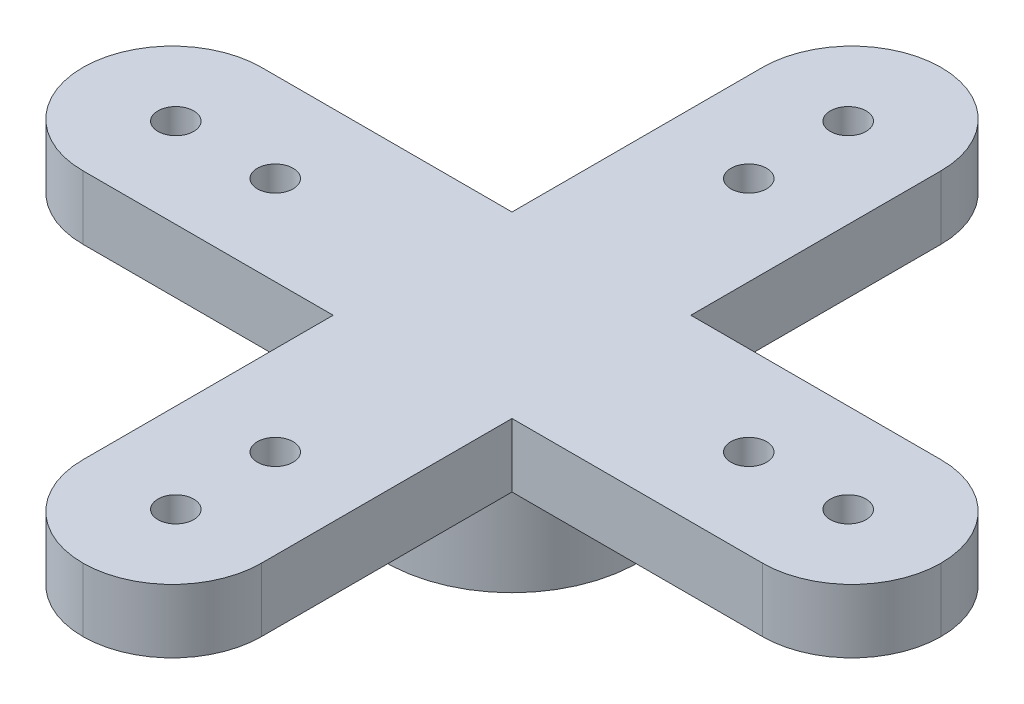
ISO-10303-21;
HEADER;
FILE_DESCRIPTION(('STEP AP214'),'2;1');
FILE_NAME('part.step','',(''),(''),'','','');
FILE_SCHEMA(('AUTOMOTIVE_DESIGN { 1 0 10303 214 1 1 1 1 }'));
ENDSEC;
DATA;
#1=APPLICATION_CONTEXT('core data for automotive mechanical design processes');
#2=APPLICATION_PROTOCOL_DEFINITION('international standard','automotive_design',2000,#1);
#3=PRODUCT_CONTEXT('',#1,'mechanical');
#4=PRODUCT('Part','Part','',(#3));
#5=PRODUCT_RELATED_PRODUCT_CATEGORY('part','',(#4));
#6=PRODUCT_DEFINITION_FORMATION('','',#4);
#7=PRODUCT_DEFINITION_CONTEXT('part definition',#1,'design');
#8=PRODUCT_DEFINITION('design','',#6,#7);
#9=PRODUCT_DEFINITION_SHAPE('','',#8);
#10=(LENGTH_UNIT() NAMED_UNIT(*) SI_UNIT(.MILLI.,.METRE.));
#11=(NAMED_UNIT(*) PLANE_ANGLE_UNIT() SI_UNIT($,.RADIAN.));
#12=(NAMED_UNIT(*) SI_UNIT($,.STERADIAN.) SOLID_ANGLE_UNIT());
#13=UNCERTAINTY_MEASURE_WITH_UNIT(LENGTH_MEASURE(1.E-05),#10,'distance_accuracy_value','');
#14=(GEOMETRIC_REPRESENTATION_CONTEXT(3) GLOBAL_UNCERTAINTY_ASSIGNED_CONTEXT((#13)) GLOBAL_UNIT_ASSIGNED_CONTEXT((#10,
#11,#12)) REPRESENTATION_CONTEXT('',''));
#15=CARTESIAN_POINT('',(0.,0.,0.));
#16=DIRECTION('',(0.,0.,1.));
#17=DIRECTION('',(1.,0.,0.));
#18=AXIS2_PLACEMENT_3D('',#15,#16,#17);
#19=CARTESIAN_POINT('',(0.,0.,0.));
#20=DIRECTION('',(0.,-1.,0.));
#21=DIRECTION('',(0.,0.,-1.));
#22=AXIS2_PLACEMENT_3D('',#19,#20,#21);
#23=PLANE('',#22);
#24=CARTESIAN_POINT('',(12.,0.,2.5));
#25=DIRECTION('',(0.,-1.,0.));
#26=DIRECTION('',(0.,0.,-1.));
#27=AXIS2_PLACEMENT_3D('',#24,#25,#26);
#28=CIRCLE('',#27,3.53553390593274);
#29=CARTESIAN_POINT('',(14.5,0.,0.));
#30=VERTEX_POINT('',#29);
#31=CARTESIAN_POINT('',(14.5,0.,5.));
#32=VERTEX_POINT('',#31);
#33=EDGE_CURVE('E45',#30,#32,#28,.T.);
#34=ORIENTED_EDGE('',*,*,#33,.F.);
#35=DIRECTION('',(-1.,0.,0.));
#36=VECTOR('',#35,1.);
#37=CARTESIAN_POINT('',(14.5,0.,0.));
#38=LINE('',#37,#36);
#39=CARTESIAN_POINT('',(21.5,0.,0.));
#40=VERTEX_POINT('',#39);
#41=EDGE_CURVE('E164',#40,#30,#38,.T.);
#42=ORIENTED_EDGE('',*,*,#41,.F.);
#43=CARTESIAN_POINT('',(21.5,0.,2.5));
#44=DIRECTION('',(0.,-1.,0.));
#45=DIRECTION('',(0.,0.,-1.));
#46=AXIS2_PLACEMENT_3D('',#43,#44,#45);
#47=CIRCLE('',#46,2.5);
#48=CARTESIAN_POINT('',(24.,0.,2.5));
#49=VERTEX_POINT('',#48);
#50=EDGE_CURVE('E297',#40,#49,#47,.T.);
#51=ORIENTED_EDGE('',*,*,#50,.T.);
#52=CARTESIAN_POINT('',(21.5,0.,2.5));
#53=DIRECTION('',(0.,-1.,0.));
#54=DIRECTION('',(0.,0.,-1.));
#55=AXIS2_PLACEMENT_3D('',#52,#53,#54);
#56=CIRCLE('',#55,2.5);
#57=CARTESIAN_POINT('',(21.5,0.,5.));
#58=VERTEX_POINT('',#57);
#59=EDGE_CURVE('E295',#49,#58,#56,.T.);
#60=ORIENTED_EDGE('',*,*,#59,.T.);
#61=DIRECTION('',(1.,0.,0.));
#62=VECTOR('',#61,1.);
#63=CARTESIAN_POINT('',(24.,0.,5.));
#64=LINE('',#63,#62);
#65=EDGE_CURVE('E185',#32,#58,#64,.T.);
#66=ORIENTED_EDGE('',*,*,#65,.F.);
#67=EDGE_LOOP('',(#34,#42,#51,#60,#66));
#68=FACE_BOUND('',#67,.T.);
#69=CARTESIAN_POINT('',(21.4,0.,2.50000000000006));
#70=DIRECTION('',(0.,1.,0.));
#71=DIRECTION('',(0.,0.,1.));
#72=AXIS2_PLACEMENT_3D('',#69,#70,#71);
#73=CIRCLE('',#72,0.500000000000001);
#74=CARTESIAN_POINT('',(21.4,0.,3.00000000000007));
#75=VERTEX_POINT('',#74);
#76=EDGE_CURVE('E235',#75,#75,#73,.T.);
#77=ORIENTED_EDGE('',*,*,#76,.T.);
#78=EDGE_LOOP('',(#77));
#79=FACE_BOUND('',#78,.T.);
#80=CARTESIAN_POINT('',(18.62,0.,2.50000000000004));
#81=DIRECTION('',(0.,1.,0.));
#82=DIRECTION('',(0.,0.,1.));
#83=AXIS2_PLACEMENT_3D('',#80,#81,#82);
#84=CIRCLE('',#83,0.500000000000001);
#85=CARTESIAN_POINT('',(18.62,0.,3.00000000000005));
#86=VERTEX_POINT('',#85);
#87=EDGE_CURVE('E216',#86,#86,#84,.T.);
#88=ORIENTED_EDGE('',*,*,#87,.T.);
#89=EDGE_LOOP('',(#88));
#90=FACE_BOUND('',#89,.T.);
#91=ADVANCED_FACE('F34',(#68,#79,#90),#23,.T.);
#92=CARTESIAN_POINT('',(9.5,0.,5.));
#93=VERTEX_POINT('',#92);
#94=EDGE_CURVE('E11',#32,#93,#28,.T.);
#95=ORIENTED_EDGE('',*,*,#94,.F.);
#96=DIRECTION('',(0.,0.,-1.));
#97=VECTOR('',#96,1.);
#98=CARTESIAN_POINT('',(14.5,0.,14.5));
#99=LINE('',#98,#97);
#100=CARTESIAN_POINT('',(14.5,0.,12.));
#101=VERTEX_POINT('',#100);
#102=EDGE_CURVE('E275',#101,#32,#99,.T.);
#103=ORIENTED_EDGE('',*,*,#102,.F.);
#104=CARTESIAN_POINT('',(12.,0.,12.));
#105=DIRECTION('',(0.,-1.,0.));
#106=DIRECTION('',(0.,0.,-1.));
#107=AXIS2_PLACEMENT_3D('',#104,#105,#106);
#108=CIRCLE('',#107,2.5);
#109=CARTESIAN_POINT('',(12.,0.,14.5));
#110=VERTEX_POINT('',#109);
#111=EDGE_CURVE('E291',#101,#110,#108,.T.);
#112=ORIENTED_EDGE('',*,*,#111,.T.);
#113=CARTESIAN_POINT('',(12.,0.,12.));
#114=DIRECTION('',(0.,-1.,0.));
#115=DIRECTION('',(0.,0.,-1.));
#116=AXIS2_PLACEMENT_3D('',#113,#114,#115);
#117=CIRCLE('',#116,2.5);
#118=CARTESIAN_POINT('',(9.5,0.,12.));
#119=VERTEX_POINT('',#118);
#120=EDGE_CURVE('E293',#110,#119,#117,.T.);
#121=ORIENTED_EDGE('',*,*,#120,.T.);
#122=DIRECTION('',(0.,0.,1.));
#123=VECTOR('',#122,1.);
#124=CARTESIAN_POINT('',(9.5,0.,5.));
#125=LINE('',#124,#123);
#126=EDGE_CURVE('E271',#93,#119,#125,.T.);
#127=ORIENTED_EDGE('',*,*,#126,.F.);
#128=EDGE_LOOP('',(#95,#103,#112,#121,#127));
#129=FACE_BOUND('',#128,.T.);
#130=CARTESIAN_POINT('',(11.9999999999999,0.,11.9));
#131=DIRECTION('',(0.,1.,0.));
#132=DIRECTION('',(0.,0.,1.));
#133=AXIS2_PLACEMENT_3D('',#130,#131,#132);
#134=CIRCLE('',#133,0.499999999999999);
#135=CARTESIAN_POINT('',(11.9999999999999,0.,12.4));
#136=VERTEX_POINT('',#135);
#137=EDGE_CURVE('E223',#136,#136,#134,.T.);
#138=ORIENTED_EDGE('',*,*,#137,.T.);
#139=EDGE_LOOP('',(#138));
#140=FACE_BOUND('',#139,.T.);
#141=CARTESIAN_POINT('',(11.9999999999999,0.,9.12));
#142=DIRECTION('',(0.,1.,0.));
#143=DIRECTION('',(0.,0.,1.));
#144=AXIS2_PLACEMENT_3D('',#141,#142,#143);
#145=CIRCLE('',#144,0.500000000000001);
#146=CARTESIAN_POINT('',(11.9999999999999,0.,9.62));
#147=VERTEX_POINT('',#146);
#148=EDGE_CURVE('E209',#147,#147,#145,.T.);
#149=ORIENTED_EDGE('',*,*,#148,.T.);
#150=EDGE_LOOP('',(#149));
#151=FACE_BOUND('',#150,.T.);
#152=ADVANCED_FACE('F395',(#129,#140,#151),#23,.T.);
#153=CARTESIAN_POINT('',(9.5,0.,0.));
#154=VERTEX_POINT('',#153);
#155=EDGE_CURVE('E43',#93,#154,#28,.T.);
#156=ORIENTED_EDGE('',*,*,#155,.F.);
#157=DIRECTION('',(1.,0.,0.));
#158=VECTOR('',#157,1.);
#159=CARTESIAN_POINT('',(9.5,0.,5.));
#160=LINE('',#159,#158);
#161=CARTESIAN_POINT('',(2.5,0.,5.));
#162=VERTEX_POINT('',#161);
#163=EDGE_CURVE('E268',#162,#93,#160,.T.);
#164=ORIENTED_EDGE('',*,*,#163,.F.);
#165=CARTESIAN_POINT('',(2.5,0.,2.5));
#166=DIRECTION('',(0.,-1.,0.));
#167=DIRECTION('',(0.,0.,-1.));
#168=AXIS2_PLACEMENT_3D('',#165,#166,#167);
#169=CIRCLE('',#168,2.5);
#170=CARTESIAN_POINT('',(0.,0.,2.5));
#171=VERTEX_POINT('',#170);
#172=EDGE_CURVE('E304',#162,#171,#169,.T.);
#173=ORIENTED_EDGE('',*,*,#172,.T.);
#174=CARTESIAN_POINT('',(2.5,0.,2.5));
#175=DIRECTION('',(0.,-1.,0.));
#176=DIRECTION('',(0.,0.,-1.));
#177=AXIS2_PLACEMENT_3D('',#174,#175,#176);
#178=CIRCLE('',#177,2.5);
#179=CARTESIAN_POINT('',(2.5,0.,0.));
#180=VERTEX_POINT('',#179);
#181=EDGE_CURVE('E302',#171,#180,#178,.T.);
#182=ORIENTED_EDGE('',*,*,#181,.T.);
#183=DIRECTION('',(-1.,0.,0.));
#184=VECTOR('',#183,1.);
#185=CARTESIAN_POINT('',(0.,0.,0.));
#186=LINE('',#185,#184);
#187=EDGE_CURVE('E253',#154,#180,#186,.T.);
#188=ORIENTED_EDGE('',*,*,#187,.F.);
#189=EDGE_LOOP('',(#156,#164,#173,#182,#188));
#190=FACE_BOUND('',#189,.T.);
#191=CARTESIAN_POINT('',(5.38,0.,2.5));
#192=DIRECTION('',(0.,1.,0.));
#193=DIRECTION('',(0.,0.,1.));
#194=AXIS2_PLACEMENT_3D('',#191,#192,#193);
#195=CIRCLE('',#194,0.5);
#196=CARTESIAN_POINT('',(5.38,0.,3.));
#197=VERTEX_POINT('',#196);
#198=EDGE_CURVE('E208',#197,#197,#195,.T.);
#199=ORIENTED_EDGE('',*,*,#198,.T.);
#200=EDGE_LOOP('',(#199));
#201=FACE_BOUND('',#200,.T.);
#202=CARTESIAN_POINT('',(2.6,0.,2.5));
#203=DIRECTION('',(0.,1.,0.));
#204=DIRECTION('',(0.,0.,1.));
#205=AXIS2_PLACEMENT_3D('',#202,#203,#204);
#206=CIRCLE('',#205,0.5);
#207=CARTESIAN_POINT('',(2.6,0.,3.));
#208=VERTEX_POINT('',#207);
#209=EDGE_CURVE('E202',#208,#208,#206,.T.);
#210=ORIENTED_EDGE('',*,*,#209,.T.);
#211=EDGE_LOOP('',(#210));
#212=FACE_BOUND('',#211,.T.);
#213=ADVANCED_FACE('F398',(#190,#201,#212),#23,.T.);
#214=CARTESIAN_POINT('',(9.5,1.78,5.));
#215=DIRECTION('',(0.,0.,-1.));
#216=DIRECTION('',(-1.,0.,0.));
#217=AXIS2_PLACEMENT_3D('',#214,#215,#216);
#218=PLANE('',#217);
#219=DIRECTION('',(1.,0.,0.));
#220=VECTOR('',#219,1.);
#221=CARTESIAN_POINT('',(9.5,1.78,5.));
#222=LINE('',#221,#220);
#223=CARTESIAN_POINT('',(2.5,1.78,5.));
#224=VERTEX_POINT('',#223);
#225=CARTESIAN_POINT('',(9.5,1.78,5.));
#226=VERTEX_POINT('',#225);
#227=EDGE_CURVE('E250',#224,#226,#222,.T.);
#228=ORIENTED_EDGE('',*,*,#227,.F.);
#229=DIRECTION('',(0.,-1.,0.));
#230=VECTOR('',#229,1.);
#231=CARTESIAN_POINT('',(2.5,1.78,5.));
#232=LINE('',#231,#230);
#233=EDGE_CURVE('E288',#224,#162,#232,.T.);
#234=ORIENTED_EDGE('',*,*,#233,.T.);
#235=ORIENTED_EDGE('',*,*,#163,.T.);
#236=DIRECTION('',(0.,-1.,0.));
#237=VECTOR('',#236,1.);
#238=CARTESIAN_POINT('',(9.5,1.78,5.));
#239=LINE('',#238,#237);
#240=EDGE_CURVE('E285',#226,#93,#239,.T.);
#241=ORIENTED_EDGE('',*,*,#240,.F.);
#242=EDGE_LOOP('',(#228,#234,#235,#241));
#243=FACE_BOUND('',#242,.T.);
#244=ADVANCED_FACE('F388',(#243),#218,.F.);
#245=CARTESIAN_POINT('',(9.5,1.78,5.));
#246=DIRECTION('',(1.,0.,0.));
#247=DIRECTION('',(0.,0.,-1.));
#248=AXIS2_PLACEMENT_3D('',#245,#246,#247);
#249=PLANE('',#248);
#250=ORIENTED_EDGE('',*,*,#126,.T.);
#251=DIRECTION('',(0.,-1.,0.));
#252=VECTOR('',#251,1.);
#253=CARTESIAN_POINT('',(9.5,1.78,12.));
#254=LINE('',#253,#252);
#255=CARTESIAN_POINT('',(9.5,1.78,12.));
#256=VERTEX_POINT('',#255);
#257=EDGE_CURVE('E197',#119,#256,#254,.F.);
#258=ORIENTED_EDGE('',*,*,#257,.T.);
#259=DIRECTION('',(0.,0.,1.));
#260=VECTOR('',#259,1.);
#261=CARTESIAN_POINT('',(9.5,1.78,5.));
#262=LINE('',#261,#260);
#263=EDGE_CURVE('E252',#226,#256,#262,.T.);
#264=ORIENTED_EDGE('',*,*,#263,.F.);
#265=ORIENTED_EDGE('',*,*,#240,.T.);
#266=EDGE_LOOP('',(#250,#258,#264,#265));
#267=FACE_BOUND('',#266,.T.);
#268=ADVANCED_FACE('F393',(#267),#249,.F.);
#269=CARTESIAN_POINT('',(14.5,1.78,14.5));
#270=DIRECTION('',(-1.,0.,0.));
#271=DIRECTION('',(0.,0.,1.));
#272=AXIS2_PLACEMENT_3D('',#269,#270,#271);
#273=PLANE('',#272);
#274=DIRECTION('',(0.,0.,-1.));
#275=VECTOR('',#274,1.);
#276=CARTESIAN_POINT('',(14.5,1.78,14.5));
#277=LINE('',#276,#275);
#278=CARTESIAN_POINT('',(14.5,1.78,12.));
#279=VERTEX_POINT('',#278);
#280=CARTESIAN_POINT('',(14.5,1.78,5.));
#281=VERTEX_POINT('',#280);
#282=EDGE_CURVE('E256',#279,#281,#277,.T.);
#283=ORIENTED_EDGE('',*,*,#282,.F.);
#284=DIRECTION('',(0.,-1.,0.));
#285=VECTOR('',#284,1.);
#286=CARTESIAN_POINT('',(14.5,1.78,12.));
#287=LINE('',#286,#285);
#288=EDGE_CURVE('E196',#279,#101,#287,.T.);
#289=ORIENTED_EDGE('',*,*,#288,.T.);
#290=ORIENTED_EDGE('',*,*,#102,.T.);
#291=DIRECTION('',(0.,-1.,0.));
#292=VECTOR('',#291,1.);
#293=CARTESIAN_POINT('',(14.5,1.78,5.));
#294=LINE('',#293,#292);
#295=EDGE_CURVE('E175',#281,#32,#294,.T.);
#296=ORIENTED_EDGE('',*,*,#295,.F.);
#297=EDGE_LOOP('',(#283,#289,#290,#296));
#298=FACE_BOUND('',#297,.T.);
#299=ADVANCED_FACE('F355',(#298),#273,.F.);
#300=CARTESIAN_POINT('',(24.,1.78,5.));
#301=DIRECTION('',(0.,0.,-1.));
#302=DIRECTION('',(-1.,0.,0.));
#303=AXIS2_PLACEMENT_3D('',#300,#301,#302);
#304=PLANE('',#303);
#305=ORIENTED_EDGE('',*,*,#65,.T.);
#306=DIRECTION('',(0.,-1.,0.));
#307=VECTOR('',#306,1.);
#308=CARTESIAN_POINT('',(21.5,1.78,5.));
#309=LINE('',#308,#307);
#310=CARTESIAN_POINT('',(21.5,1.78,5.));
#311=VERTEX_POINT('',#310);
#312=EDGE_CURVE('E328',#58,#311,#309,.F.);
#313=ORIENTED_EDGE('',*,*,#312,.T.);
#314=DIRECTION('',(1.,0.,0.));
#315=VECTOR('',#314,1.);
#316=CARTESIAN_POINT('',(24.,1.78,5.));
#317=LINE('',#316,#315);
#318=EDGE_CURVE('E258',#281,#311,#317,.T.);
#319=ORIENTED_EDGE('',*,*,#318,.F.);
#320=ORIENTED_EDGE('',*,*,#295,.T.);
#321=EDGE_LOOP('',(#305,#313,#319,#320));
#322=FACE_BOUND('',#321,.T.);
#323=ADVANCED_FACE('F359',(#322),#304,.F.);
#324=CARTESIAN_POINT('',(14.5,1.78,0.));
#325=DIRECTION('',(0.,0.,1.));
#326=DIRECTION('',(1.,0.,0.));
#327=AXIS2_PLACEMENT_3D('',#324,#325,#326);
#328=PLANE('',#327);
#329=DIRECTION('',(-1.,0.,0.));
#330=VECTOR('',#329,1.);
#331=CARTESIAN_POINT('',(14.5,1.78,0.));
#332=LINE('',#331,#330);
#333=CARTESIAN_POINT('',(21.5,1.78,0.));
#334=VERTEX_POINT('',#333);
#335=CARTESIAN_POINT('',(14.5,1.78,0.));
#336=VERTEX_POINT('',#335);
#337=EDGE_CURVE('E261',#334,#336,#332,.T.);
#338=ORIENTED_EDGE('',*,*,#337,.F.);
#339=DIRECTION('',(0.,-1.,0.));
#340=VECTOR('',#339,1.);
#341=CARTESIAN_POINT('',(21.5,1.78,0.));
#342=LINE('',#341,#340);
#343=EDGE_CURVE('E183',#334,#40,#342,.T.);
#344=ORIENTED_EDGE('',*,*,#343,.T.);
#345=ORIENTED_EDGE('',*,*,#41,.T.);
#346=DIRECTION('',(0.,-1.,0.));
#347=VECTOR('',#346,1.);
#348=CARTESIAN_POINT('',(14.5,1.78,0.));
#349=LINE('',#348,#347);
#350=EDGE_CURVE('E168',#336,#30,#349,.T.);
#351=ORIENTED_EDGE('',*,*,#350,.F.);
#352=EDGE_LOOP('',(#338,#344,#345,#351));
#353=FACE_BOUND('',#352,.T.);
#354=ADVANCED_FACE('F181',(#353),#328,.F.);
#355=CARTESIAN_POINT('',(14.5,1.78,0.));
#356=DIRECTION('',(-1.,0.,0.));
#357=DIRECTION('',(0.,0.,1.));
#358=AXIS2_PLACEMENT_3D('',#355,#356,#357);
#359=PLANE('',#358);
#360=DIRECTION('',(0.,0.,-1.));
#361=VECTOR('',#360,1.);
#362=CARTESIAN_POINT('',(14.5,0.,0.));
#363=LINE('',#362,#361);
#364=CARTESIAN_POINT('',(14.5,0.,-7.));
#365=VERTEX_POINT('',#364);
#366=EDGE_CURVE('E151',#30,#365,#363,.T.);
#367=ORIENTED_EDGE('',*,*,#366,.T.);
#368=DIRECTION('',(0.,-1.,0.));
#369=VECTOR('',#368,1.);
#370=CARTESIAN_POINT('',(14.5,1.78,-7.));
#371=LINE('',#370,#369);
#372=CARTESIAN_POINT('',(14.5,1.78,-7.));
#373=VERTEX_POINT('',#372);
#374=EDGE_CURVE('E325',#365,#373,#371,.F.);
#375=ORIENTED_EDGE('',*,*,#374,.T.);
#376=DIRECTION('',(0.,0.,-1.));
#377=VECTOR('',#376,1.);
#378=CARTESIAN_POINT('',(14.5,1.78,0.));
#379=LINE('',#378,#377);
#380=EDGE_CURVE('E172',#336,#373,#379,.T.);
#381=ORIENTED_EDGE('',*,*,#380,.F.);
#382=ORIENTED_EDGE('',*,*,#350,.T.);
#383=EDGE_LOOP('',(#367,#375,#381,#382));
#384=FACE_BOUND('',#383,.T.);
#385=ADVANCED_FACE('F170',(#384),#359,.F.);
#386=CARTESIAN_POINT('',(9.5,1.78,-9.5));
#387=DIRECTION('',(1.,0.,0.));
#388=DIRECTION('',(0.,0.,-1.));
#389=AXIS2_PLACEMENT_3D('',#386,#387,#388);
#390=PLANE('',#389);
#391=DIRECTION('',(0.,0.,1.));
#392=VECTOR('',#391,1.);
#393=CARTESIAN_POINT('',(9.5,1.78,-9.5));
#394=LINE('',#393,#392);
#395=CARTESIAN_POINT('',(9.5,1.78,-7.));
#396=VERTEX_POINT('',#395);
#397=CARTESIAN_POINT('',(9.5,1.78,0.));
#398=VERTEX_POINT('',#397);
#399=EDGE_CURVE('E264',#396,#398,#394,.T.);
#400=ORIENTED_EDGE('',*,*,#399,.F.);
#401=DIRECTION('',(0.,-1.,0.));
#402=VECTOR('',#401,1.);
#403=CARTESIAN_POINT('',(9.5,1.78,-7.));
#404=LINE('',#403,#402);
#405=CARTESIAN_POINT('',(9.5,0.,-7.));
#406=VERTEX_POINT('',#405);
#407=EDGE_CURVE('E322',#396,#406,#404,.T.);
#408=ORIENTED_EDGE('',*,*,#407,.T.);
#409=DIRECTION('',(0.,0.,1.));
#410=VECTOR('',#409,1.);
#411=CARTESIAN_POINT('',(9.5,0.,-9.5));
#412=LINE('',#411,#410);
#413=EDGE_CURVE('E163',#406,#154,#412,.T.);
#414=ORIENTED_EDGE('',*,*,#413,.T.);
#415=DIRECTION('',(0.,-1.,0.));
#416=VECTOR('',#415,1.);
#417=CARTESIAN_POINT('',(9.5,1.78,0.));
#418=LINE('',#417,#416);
#419=EDGE_CURVE('E176',#398,#154,#418,.T.);
#420=ORIENTED_EDGE('',*,*,#419,.F.);
#421=EDGE_LOOP('',(#400,#408,#414,#420));
#422=FACE_BOUND('',#421,.T.);
#423=ADVANCED_FACE('F374',(#422),#390,.F.);
#424=CARTESIAN_POINT('',(0.,1.78,0.));
#425=DIRECTION('',(0.,0.,1.));
#426=DIRECTION('',(1.,0.,0.));
#427=AXIS2_PLACEMENT_3D('',#424,#425,#426);
#428=PLANE('',#427);
#429=ORIENTED_EDGE('',*,*,#187,.T.);
#430=DIRECTION('',(0.,-1.,0.));
#431=VECTOR('',#430,1.);
#432=CARTESIAN_POINT('',(2.5,1.78,0.));
#433=LINE('',#432,#431);
#434=CARTESIAN_POINT('',(2.5,1.78,0.));
#435=VERTEX_POINT('',#434);
#436=EDGE_CURVE('E52',#180,#435,#433,.F.);
#437=ORIENTED_EDGE('',*,*,#436,.T.);
#438=DIRECTION('',(-1.,0.,0.));
#439=VECTOR('',#438,1.);
#440=CARTESIAN_POINT('',(0.,1.78,0.));
#441=LINE('',#440,#439);
#442=EDGE_CURVE('E266',#398,#435,#441,.T.);
#443=ORIENTED_EDGE('',*,*,#442,.F.);
#444=ORIENTED_EDGE('',*,*,#419,.T.);
#445=EDGE_LOOP('',(#429,#437,#443,#444));
#446=FACE_BOUND('',#445,.T.);
#447=ADVANCED_FACE('F414',(#446),#428,.F.);
#448=CARTESIAN_POINT('',(0.,1.78,0.));
#449=DIRECTION('',(0.,-1.,0.));
#450=DIRECTION('',(0.,0.,-1.));
#451=AXIS2_PLACEMENT_3D('',#448,#449,#450);
#452=PLANE('',#451);
#453=CARTESIAN_POINT('',(2.6,1.78,2.5));
#454=DIRECTION('',(0.,1.,0.));
#455=DIRECTION('',(0.,0.,1.));
#456=AXIS2_PLACEMENT_3D('',#453,#454,#455);
#457=CIRCLE('',#456,0.5);
#458=CARTESIAN_POINT('',(2.6,1.78,3.));
#459=VERTEX_POINT('',#458);
#460=EDGE_CURVE('E205',#459,#459,#457,.T.);
#461=ORIENTED_EDGE('',*,*,#460,.F.);
#462=EDGE_LOOP('',(#461));
#463=FACE_BOUND('',#462,.T.);
#464=CARTESIAN_POINT('',(18.62,1.78,2.50000000000004));
#465=DIRECTION('',(0.,1.,0.));
#466=DIRECTION('',(0.,0.,1.));
#467=AXIS2_PLACEMENT_3D('',#464,#465,#466);
#468=CIRCLE('',#467,0.500000000000001);
#469=CARTESIAN_POINT('',(18.62,1.78,3.00000000000005));
#470=VERTEX_POINT('',#469);
#471=EDGE_CURVE('E220',#470,#470,#468,.T.);
#472=ORIENTED_EDGE('',*,*,#471,.F.);
#473=EDGE_LOOP('',(#472));
#474=FACE_BOUND('',#473,.T.);
#475=CARTESIAN_POINT('',(11.9999999999999,1.78,11.9));
#476=DIRECTION('',(0.,1.,0.));
#477=DIRECTION('',(0.,0.,1.));
#478=AXIS2_PLACEMENT_3D('',#475,#476,#477);
#479=CIRCLE('',#478,0.499999999999999);
#480=CARTESIAN_POINT('',(11.9999999999999,1.78,12.4));
#481=VERTEX_POINT('',#480);
#482=EDGE_CURVE('E212',#481,#481,#479,.T.);
#483=ORIENTED_EDGE('',*,*,#482,.F.);
#484=EDGE_LOOP('',(#483));
#485=FACE_BOUND('',#484,.T.);
#486=CARTESIAN_POINT('',(11.9999999999999,1.78,9.12));
#487=DIRECTION('',(0.,1.,0.));
#488=DIRECTION('',(0.,0.,1.));
#489=AXIS2_PLACEMENT_3D('',#486,#487,#488);
#490=CIRCLE('',#489,0.500000000000001);
#491=CARTESIAN_POINT('',(11.9999999999999,1.78,9.62));
#492=VERTEX_POINT('',#491);
#493=EDGE_CURVE('E213',#492,#492,#490,.T.);
#494=ORIENTED_EDGE('',*,*,#493,.F.);
#495=EDGE_LOOP('',(#494));
#496=FACE_BOUND('',#495,.T.);
#497=CARTESIAN_POINT('',(5.38,1.78,2.5));
#498=DIRECTION('',(0.,1.,0.));
#499=DIRECTION('',(0.,0.,1.));
#500=AXIS2_PLACEMENT_3D('',#497,#498,#499);
#501=CIRCLE('',#500,0.5);
#502=CARTESIAN_POINT('',(5.38,1.78,3.));
#503=VERTEX_POINT('',#502);
#504=EDGE_CURVE('E242',#503,#503,#501,.T.);
#505=ORIENTED_EDGE('',*,*,#504,.F.);
#506=EDGE_LOOP('',(#505));
#507=FACE_BOUND('',#506,.T.);
#508=CARTESIAN_POINT('',(12.,1.78,-6.9));
#509=DIRECTION('',(0.,1.,0.));
#510=DIRECTION('',(0.,0.,1.));
#511=AXIS2_PLACEMENT_3D('',#508,#509,#510);
#512=CIRCLE('',#511,0.5);
#513=CARTESIAN_POINT('',(12.,1.78,-6.4));
#514=VERTEX_POINT('',#513);
#515=EDGE_CURVE('E231',#514,#514,#512,.T.);
#516=ORIENTED_EDGE('',*,*,#515,.F.);
#517=EDGE_LOOP('',(#516));
#518=FACE_BOUND('',#517,.T.);
#519=CARTESIAN_POINT('',(12.,1.78,-4.12));
#520=DIRECTION('',(0.,1.,0.));
#521=DIRECTION('',(0.,0.,1.));
#522=AXIS2_PLACEMENT_3D('',#519,#520,#521);
#523=CIRCLE('',#522,0.5);
#524=CARTESIAN_POINT('',(12.,1.78,-3.62));
#525=VERTEX_POINT('',#524);
#526=EDGE_CURVE('E232',#525,#525,#523,.T.);
#527=ORIENTED_EDGE('',*,*,#526,.F.);
#528=EDGE_LOOP('',(#527));
#529=FACE_BOUND('',#528,.T.);
#530=CARTESIAN_POINT('',(21.4,1.78,2.50000000000006));
#531=DIRECTION('',(0.,1.,0.));
#532=DIRECTION('',(0.,0.,1.));
#533=AXIS2_PLACEMENT_3D('',#530,#531,#532);
#534=CIRCLE('',#533,0.500000000000001);
#535=CARTESIAN_POINT('',(21.4,1.78,3.00000000000007));
#536=VERTEX_POINT('',#535);
#537=EDGE_CURVE('E219',#536,#536,#534,.T.);
#538=ORIENTED_EDGE('',*,*,#537,.F.);
#539=EDGE_LOOP('',(#538));
#540=FACE_BOUND('',#539,.T.);
#541=CARTESIAN_POINT('',(2.5,1.78,2.5));
#542=DIRECTION('',(0.,-1.,0.));
#543=DIRECTION('',(0.,0.,-1.));
#544=AXIS2_PLACEMENT_3D('',#541,#542,#543);
#545=CIRCLE('',#544,2.5);
#546=CARTESIAN_POINT('',(0.,1.78,2.5));
#547=VERTEX_POINT('',#546);
#548=EDGE_CURVE('E317',#435,#547,#545,.F.);
#549=ORIENTED_EDGE('',*,*,#548,.T.);
#550=CARTESIAN_POINT('',(2.5,1.78,2.5));
#551=DIRECTION('',(0.,-1.,0.));
#552=DIRECTION('',(0.,0.,-1.));
#553=AXIS2_PLACEMENT_3D('',#550,#551,#552);
#554=CIRCLE('',#553,2.5);
#555=EDGE_CURVE('E319',#547,#224,#554,.F.);
#556=ORIENTED_EDGE('',*,*,#555,.T.);
#557=ORIENTED_EDGE('',*,*,#227,.T.);
#558=ORIENTED_EDGE('',*,*,#263,.T.);
#559=CARTESIAN_POINT('',(12.,1.78,12.));
#560=DIRECTION('',(0.,-1.,0.));
#561=DIRECTION('',(0.,0.,-1.));
#562=AXIS2_PLACEMENT_3D('',#559,#560,#561);
#563=CIRCLE('',#562,2.5);
#564=CARTESIAN_POINT('',(12.,1.78,14.5));
#565=VERTEX_POINT('',#564);
#566=EDGE_CURVE('E308',#256,#565,#563,.F.);
#567=ORIENTED_EDGE('',*,*,#566,.T.);
#568=CARTESIAN_POINT('',(12.,1.78,12.));
#569=DIRECTION('',(0.,-1.,0.));
#570=DIRECTION('',(0.,0.,-1.));
#571=AXIS2_PLACEMENT_3D('',#568,#569,#570);
#572=CIRCLE('',#571,2.5);
#573=EDGE_CURVE('E306',#565,#279,#572,.F.);
#574=ORIENTED_EDGE('',*,*,#573,.T.);
#575=ORIENTED_EDGE('',*,*,#282,.T.);
#576=ORIENTED_EDGE('',*,*,#318,.T.);
#577=CARTESIAN_POINT('',(21.5,1.78,2.5));
#578=DIRECTION('',(0.,-1.,0.));
#579=DIRECTION('',(0.,0.,-1.));
#580=AXIS2_PLACEMENT_3D('',#577,#578,#579);
#581=CIRCLE('',#580,2.5);
#582=CARTESIAN_POINT('',(24.,1.78,2.5));
#583=VERTEX_POINT('',#582);
#584=EDGE_CURVE('E310',#311,#583,#581,.F.);
#585=ORIENTED_EDGE('',*,*,#584,.T.);
#586=CARTESIAN_POINT('',(21.5,1.78,2.5));
#587=DIRECTION('',(0.,-1.,0.));
#588=DIRECTION('',(0.,0.,-1.));
#589=AXIS2_PLACEMENT_3D('',#586,#587,#588);
#590=CIRCLE('',#589,2.5);
#591=EDGE_CURVE('E312',#583,#334,#590,.F.);
#592=ORIENTED_EDGE('',*,*,#591,.T.);
#593=ORIENTED_EDGE('',*,*,#337,.T.);
#594=ORIENTED_EDGE('',*,*,#380,.T.);
#595=CARTESIAN_POINT('',(12.,1.78,-7.));
#596=DIRECTION('',(0.,-1.,0.));
#597=DIRECTION('',(0.,0.,-1.));
#598=AXIS2_PLACEMENT_3D('',#595,#596,#597);
#599=CIRCLE('',#598,2.5);
#600=CARTESIAN_POINT('',(12.,1.78,-9.5));
#601=VERTEX_POINT('',#600);
#602=EDGE_CURVE('E314',#373,#601,#599,.F.);
#603=ORIENTED_EDGE('',*,*,#602,.T.);
#604=CARTESIAN_POINT('',(12.,1.78,-7.));
#605=DIRECTION('',(0.,-1.,0.));
#606=DIRECTION('',(0.,0.,-1.));
#607=AXIS2_PLACEMENT_3D('',#604,#605,#606);
#608=CIRCLE('',#607,2.5);
#609=EDGE_CURVE('E60',#601,#396,#608,.F.);
#610=ORIENTED_EDGE('',*,*,#609,.T.);
#611=ORIENTED_EDGE('',*,*,#399,.T.);
#612=ORIENTED_EDGE('',*,*,#442,.T.);
#613=EDGE_LOOP('',(#549,#556,#557,#558,#567,#574,#575,#576,#585,#592,#593,#594,#603,#610,#611,#612));
#614=FACE_BOUND('',#613,.T.);
#615=ADVANCED_FACE('F352',(#463,#474,#485,#496,#507,#518,#529,#540,#614),#452,.F.);
#616=EDGE_CURVE('E157',#154,#30,#28,.T.);
#617=ORIENTED_EDGE('',*,*,#616,.F.);
#618=ORIENTED_EDGE('',*,*,#413,.F.);
#619=CARTESIAN_POINT('',(12.,0.,-7.));
#620=DIRECTION('',(0.,-1.,0.));
#621=DIRECTION('',(0.,0.,-1.));
#622=AXIS2_PLACEMENT_3D('',#619,#620,#621);
#623=CIRCLE('',#622,2.5);
#624=CARTESIAN_POINT('',(12.,0.,-9.5));
#625=VERTEX_POINT('',#624);
#626=EDGE_CURVE('E300',#406,#625,#623,.T.);
#627=ORIENTED_EDGE('',*,*,#626,.T.);
#628=CARTESIAN_POINT('',(12.,0.,-7.));
#629=DIRECTION('',(0.,-1.,0.));
#630=DIRECTION('',(0.,0.,-1.));
#631=AXIS2_PLACEMENT_3D('',#628,#629,#630);
#632=CIRCLE('',#631,2.5);
#633=EDGE_CURVE('E160',#625,#365,#632,.T.);
#634=ORIENTED_EDGE('',*,*,#633,.T.);
#635=ORIENTED_EDGE('',*,*,#366,.F.);
#636=EDGE_LOOP('',(#617,#618,#627,#634,#635));
#637=FACE_BOUND('',#636,.T.);
#638=CARTESIAN_POINT('',(12.,0.,-6.9));
#639=DIRECTION('',(0.,1.,0.));
#640=DIRECTION('',(0.,0.,1.));
#641=AXIS2_PLACEMENT_3D('',#638,#639,#640);
#642=CIRCLE('',#641,0.5);
#643=CARTESIAN_POINT('',(12.,0.,-6.4));
#644=VERTEX_POINT('',#643);
#645=EDGE_CURVE('E245',#644,#644,#642,.T.);
#646=ORIENTED_EDGE('',*,*,#645,.T.);
#647=EDGE_LOOP('',(#646));
#648=FACE_BOUND('',#647,.T.);
#649=CARTESIAN_POINT('',(12.,0.,-4.12));
#650=DIRECTION('',(0.,1.,0.));
#651=DIRECTION('',(0.,0.,1.));
#652=AXIS2_PLACEMENT_3D('',#649,#650,#651);
#653=CIRCLE('',#652,0.5);
#654=CARTESIAN_POINT('',(12.,0.,-3.62));
#655=VERTEX_POINT('',#654);
#656=EDGE_CURVE('E228',#655,#655,#653,.T.);
#657=ORIENTED_EDGE('',*,*,#656,.T.);
#658=EDGE_LOOP('',(#657));
#659=FACE_BOUND('',#658,.T.);
#660=ADVANCED_FACE('F153',(#637,#648,#659),#23,.T.);
#661=CARTESIAN_POINT('',(2.5,1.78,2.5));
#662=DIRECTION('',(0.,-1.,0.));
#663=DIRECTION('',(0.,0.,-1.));
#664=AXIS2_PLACEMENT_3D('',#661,#662,#663);
#665=CYLINDRICAL_SURFACE('',#664,2.5);
#666=DIRECTION('',(0.,-1.,0.));
#667=VECTOR('',#666,1.);
#668=CARTESIAN_POINT('',(0.,1.78,2.5));
#669=LINE('',#668,#667);
#670=EDGE_CURVE('E272',#547,#171,#669,.T.);
#671=ORIENTED_EDGE('',*,*,#670,.F.);
#672=ORIENTED_EDGE('',*,*,#548,.F.);
#673=ORIENTED_EDGE('',*,*,#436,.F.);
#674=ORIENTED_EDGE('',*,*,#181,.F.);
#675=EDGE_LOOP('',(#671,#672,#673,#674));
#676=FACE_BOUND('',#675,.T.);
#677=ADVANCED_FACE('F379',(#676),#665,.T.);
#678=CARTESIAN_POINT('',(2.5,1.78,2.5));
#679=DIRECTION('',(0.,-1.,0.));
#680=DIRECTION('',(0.,0.,-1.));
#681=AXIS2_PLACEMENT_3D('',#678,#679,#680);
#682=CYLINDRICAL_SURFACE('',#681,2.5);
#683=ORIENTED_EDGE('',*,*,#555,.F.);
#684=ORIENTED_EDGE('',*,*,#670,.T.);
#685=ORIENTED_EDGE('',*,*,#172,.F.);
#686=ORIENTED_EDGE('',*,*,#233,.F.);
#687=EDGE_LOOP('',(#683,#684,#685,#686));
#688=FACE_BOUND('',#687,.T.);
#689=ADVANCED_FACE('F384',(#688),#682,.T.);
#690=CARTESIAN_POINT('',(12.,1.78,-7.));
#691=DIRECTION('',(0.,-1.,0.));
#692=DIRECTION('',(0.,0.,-1.));
#693=AXIS2_PLACEMENT_3D('',#690,#691,#692);
#694=CYLINDRICAL_SURFACE('',#693,2.5);
#695=DIRECTION('',(0.,-1.,0.));
#696=VECTOR('',#695,1.);
#697=CARTESIAN_POINT('',(12.,1.78,-9.5));
#698=LINE('',#697,#696);
#699=EDGE_CURVE('E334',#601,#625,#698,.T.);
#700=ORIENTED_EDGE('',*,*,#699,.F.);
#701=ORIENTED_EDGE('',*,*,#602,.F.);
#702=ORIENTED_EDGE('',*,*,#374,.F.);
#703=ORIENTED_EDGE('',*,*,#633,.F.);
#704=EDGE_LOOP('',(#700,#701,#702,#703));
#705=FACE_BOUND('',#704,.T.);
#706=ADVANCED_FACE('F369',(#705),#694,.T.);
#707=CARTESIAN_POINT('',(12.,1.78,-7.));
#708=DIRECTION('',(0.,-1.,0.));
#709=DIRECTION('',(0.,0.,-1.));
#710=AXIS2_PLACEMENT_3D('',#707,#708,#709);
#711=CYLINDRICAL_SURFACE('',#710,2.5);
#712=ORIENTED_EDGE('',*,*,#609,.F.);
#713=ORIENTED_EDGE('',*,*,#699,.T.);
#714=ORIENTED_EDGE('',*,*,#626,.F.);
#715=ORIENTED_EDGE('',*,*,#407,.F.);
#716=EDGE_LOOP('',(#712,#713,#714,#715));
#717=FACE_BOUND('',#716,.T.);
#718=ADVANCED_FACE('F372',(#717),#711,.T.);
#719=CARTESIAN_POINT('',(21.5,1.78,2.5));
#720=DIRECTION('',(0.,-1.,0.));
#721=DIRECTION('',(0.,0.,-1.));
#722=AXIS2_PLACEMENT_3D('',#719,#720,#721);
#723=CYLINDRICAL_SURFACE('',#722,2.5);
#724=DIRECTION('',(0.,-1.,0.));
#725=VECTOR('',#724,1.);
#726=CARTESIAN_POINT('',(24.,1.78,2.5));
#727=LINE('',#726,#725);
#728=EDGE_CURVE('E336',#583,#49,#727,.T.);
#729=ORIENTED_EDGE('',*,*,#728,.F.);
#730=ORIENTED_EDGE('',*,*,#584,.F.);
#731=ORIENTED_EDGE('',*,*,#312,.F.);
#732=ORIENTED_EDGE('',*,*,#59,.F.);
#733=EDGE_LOOP('',(#729,#730,#731,#732));
#734=FACE_BOUND('',#733,.T.);
#735=ADVANCED_FACE('F363',(#734),#723,.T.);
#736=CARTESIAN_POINT('',(21.5,1.78,2.5));
#737=DIRECTION('',(0.,-1.,0.));
#738=DIRECTION('',(0.,0.,-1.));
#739=AXIS2_PLACEMENT_3D('',#736,#737,#738);
#740=CYLINDRICAL_SURFACE('',#739,2.5);
#741=ORIENTED_EDGE('',*,*,#591,.F.);
#742=ORIENTED_EDGE('',*,*,#728,.T.);
#743=ORIENTED_EDGE('',*,*,#50,.F.);
#744=ORIENTED_EDGE('',*,*,#343,.F.);
#745=EDGE_LOOP('',(#741,#742,#743,#744));
#746=FACE_BOUND('',#745,.T.);
#747=ADVANCED_FACE('F365',(#746),#740,.T.);
#748=CARTESIAN_POINT('',(12.,1.78,12.));
#749=DIRECTION('',(0.,-1.,0.));
#750=DIRECTION('',(0.,0.,-1.));
#751=AXIS2_PLACEMENT_3D('',#748,#749,#750);
#752=CYLINDRICAL_SURFACE('',#751,2.5);
#753=ORIENTED_EDGE('',*,*,#288,.F.);
#754=ORIENTED_EDGE('',*,*,#573,.F.);
#755=DIRECTION('',(0.,-1.,0.));
#756=VECTOR('',#755,1.);
#757=CARTESIAN_POINT('',(12.,1.78,14.5));
#758=LINE('',#757,#756);
#759=EDGE_CURVE('E38',#110,#565,#758,.F.);
#760=ORIENTED_EDGE('',*,*,#759,.F.);
#761=ORIENTED_EDGE('',*,*,#111,.F.);
#762=EDGE_LOOP('',(#753,#754,#760,#761));
#763=FACE_BOUND('',#762,.T.);
#764=ADVANCED_FACE('F36',(#763),#752,.T.);
#765=CARTESIAN_POINT('',(12.,1.78,12.));
#766=DIRECTION('',(0.,-1.,0.));
#767=DIRECTION('',(0.,0.,-1.));
#768=AXIS2_PLACEMENT_3D('',#765,#766,#767);
#769=CYLINDRICAL_SURFACE('',#768,2.5);
#770=ORIENTED_EDGE('',*,*,#566,.F.);
#771=ORIENTED_EDGE('',*,*,#257,.F.);
#772=ORIENTED_EDGE('',*,*,#120,.F.);
#773=ORIENTED_EDGE('',*,*,#759,.T.);
#774=EDGE_LOOP('',(#770,#771,#772,#773));
#775=FACE_BOUND('',#774,.T.);
#776=ADVANCED_FACE('F345',(#775),#769,.T.);
#777=CARTESIAN_POINT('',(21.4,0.,2.50000000000006));
#778=DIRECTION('',(0.,1.,0.));
#779=DIRECTION('',(0.,0.,1.));
#780=AXIS2_PLACEMENT_3D('',#777,#778,#779);
#781=CYLINDRICAL_SURFACE('',#780,0.500000000000001);
#782=ORIENTED_EDGE('',*,*,#76,.F.);
#783=EDGE_LOOP('',(#782));
#784=FACE_BOUND('',#783,.T.);
#785=ORIENTED_EDGE('',*,*,#537,.T.);
#786=EDGE_LOOP('',(#785));
#787=FACE_BOUND('',#786,.T.);
#788=ADVANCED_FACE('F425',(#784,#787),#781,.F.);
#789=CARTESIAN_POINT('',(12.,0.,-4.12));
#790=DIRECTION('',(0.,1.,0.));
#791=DIRECTION('',(0.,0.,1.));
#792=AXIS2_PLACEMENT_3D('',#789,#790,#791);
#793=CYLINDRICAL_SURFACE('',#792,0.5);
#794=ORIENTED_EDGE('',*,*,#656,.F.);
#795=EDGE_LOOP('',(#794));
#796=FACE_BOUND('',#795,.T.);
#797=ORIENTED_EDGE('',*,*,#526,.T.);
#798=EDGE_LOOP('',(#797));
#799=FACE_BOUND('',#798,.T.);
#800=ADVANCED_FACE('F427',(#796,#799),#793,.F.);
#801=CARTESIAN_POINT('',(12.,0.,-6.9));
#802=DIRECTION('',(0.,1.,0.));
#803=DIRECTION('',(0.,0.,1.));
#804=AXIS2_PLACEMENT_3D('',#801,#802,#803);
#805=CYLINDRICAL_SURFACE('',#804,0.5);
#806=ORIENTED_EDGE('',*,*,#645,.F.);
#807=EDGE_LOOP('',(#806));
#808=FACE_BOUND('',#807,.T.);
#809=ORIENTED_EDGE('',*,*,#515,.T.);
#810=EDGE_LOOP('',(#809));
#811=FACE_BOUND('',#810,.T.);
#812=ADVANCED_FACE('F434',(#808,#811),#805,.F.);
#813=CARTESIAN_POINT('',(5.38,0.,2.5));
#814=DIRECTION('',(0.,1.,0.));
#815=DIRECTION('',(0.,0.,1.));
#816=AXIS2_PLACEMENT_3D('',#813,#814,#815);
#817=CYLINDRICAL_SURFACE('',#816,0.5);
#818=ORIENTED_EDGE('',*,*,#198,.F.);
#819=EDGE_LOOP('',(#818));
#820=FACE_BOUND('',#819,.T.);
#821=ORIENTED_EDGE('',*,*,#504,.T.);
#822=EDGE_LOOP('',(#821));
#823=FACE_BOUND('',#822,.T.);
#824=ADVANCED_FACE('F408',(#820,#823),#817,.F.);
#825=CARTESIAN_POINT('',(11.9999999999999,0.,9.12));
#826=DIRECTION('',(0.,1.,0.));
#827=DIRECTION('',(0.,0.,1.));
#828=AXIS2_PLACEMENT_3D('',#825,#826,#827);
#829=CYLINDRICAL_SURFACE('',#828,0.500000000000001);
#830=ORIENTED_EDGE('',*,*,#148,.F.);
#831=EDGE_LOOP('',(#830));
#832=FACE_BOUND('',#831,.T.);
#833=ORIENTED_EDGE('',*,*,#493,.T.);
#834=EDGE_LOOP('',(#833));
#835=FACE_BOUND('',#834,.T.);
#836=ADVANCED_FACE('F404',(#832,#835),#829,.F.);
#837=CARTESIAN_POINT('',(11.9999999999999,0.,11.9));
#838=DIRECTION('',(0.,1.,0.));
#839=DIRECTION('',(0.,0.,1.));
#840=AXIS2_PLACEMENT_3D('',#837,#838,#839);
#841=CYLINDRICAL_SURFACE('',#840,0.499999999999999);
#842=ORIENTED_EDGE('',*,*,#137,.F.);
#843=EDGE_LOOP('',(#842));
#844=FACE_BOUND('',#843,.T.);
#845=ORIENTED_EDGE('',*,*,#482,.T.);
#846=EDGE_LOOP('',(#845));
#847=FACE_BOUND('',#846,.T.);
#848=ADVANCED_FACE('F407',(#844,#847),#841,.F.);
#849=CARTESIAN_POINT('',(18.62,0.,2.50000000000004));
#850=DIRECTION('',(0.,1.,0.));
#851=DIRECTION('',(0.,0.,1.));
#852=AXIS2_PLACEMENT_3D('',#849,#850,#851);
#853=CYLINDRICAL_SURFACE('',#852,0.500000000000001);
#854=ORIENTED_EDGE('',*,*,#87,.F.);
#855=EDGE_LOOP('',(#854));
#856=FACE_BOUND('',#855,.T.);
#857=ORIENTED_EDGE('',*,*,#471,.T.);
#858=EDGE_LOOP('',(#857));
#859=FACE_BOUND('',#858,.T.);
#860=ADVANCED_FACE('F474',(#856,#859),#853,.F.);
#861=CARTESIAN_POINT('',(2.6,0.,2.5));
#862=DIRECTION('',(0.,1.,0.));
#863=DIRECTION('',(0.,0.,1.));
#864=AXIS2_PLACEMENT_3D('',#861,#862,#863);
#865=CYLINDRICAL_SURFACE('',#864,0.5);
#866=ORIENTED_EDGE('',*,*,#209,.F.);
#867=EDGE_LOOP('',(#866));
#868=FACE_BOUND('',#867,.T.);
#869=ORIENTED_EDGE('',*,*,#460,.T.);
#870=EDGE_LOOP('',(#869));
#871=FACE_BOUND('',#870,.T.);
#872=ADVANCED_FACE('F470',(#868,#871),#865,.F.);
#873=CARTESIAN_POINT('',(12.,-2.44,2.5));
#874=DIRECTION('',(0.,-1.,0.));
#875=DIRECTION('',(0.,0.,-1.));
#876=AXIS2_PLACEMENT_3D('',#873,#874,#875);
#877=PLANE('',#876);
#878=CARTESIAN_POINT('',(12.,-2.44,2.5));
#879=DIRECTION('',(0.,-1.,0.));
#880=DIRECTION('',(0.,0.,-1.));
#881=AXIS2_PLACEMENT_3D('',#878,#879,#880);
#882=CIRCLE('',#881,3.53553390593274);
#883=CARTESIAN_POINT('',(12.,-2.44,-1.03553390593274));
#884=VERTEX_POINT('',#883);
#885=EDGE_CURVE('E192',#884,#884,#882,.T.);
#886=ORIENTED_EDGE('',*,*,#885,.T.);
#887=EDGE_LOOP('',(#886));
#888=FACE_BOUND('',#887,.T.);
#889=CARTESIAN_POINT('',(12.,-2.44,2.5));
#890=DIRECTION('',(0.,-1.,0.));
#891=DIRECTION('',(0.,0.,-1.));
#892=AXIS2_PLACEMENT_3D('',#889,#890,#891);
#893=CIRCLE('',#892,2.);
#894=CARTESIAN_POINT('',(12.,-2.44,0.5));
#895=VERTEX_POINT('',#894);
#896=EDGE_CURVE('E193',#895,#895,#893,.T.);
#897=ORIENTED_EDGE('',*,*,#896,.F.);
#898=EDGE_LOOP('',(#897));
#899=FACE_BOUND('',#898,.T.);
#900=ADVANCED_FACE('F473',(#888,#899),#877,.T.);
#901=CARTESIAN_POINT('',(12.,-2.44,2.5));
#902=DIRECTION('',(0.,1.,0.));
#903=DIRECTION('',(0.,0.,1.));
#904=AXIS2_PLACEMENT_3D('',#901,#902,#903);
#905=CYLINDRICAL_SURFACE('',#904,3.53553390593274);
#906=ORIENTED_EDGE('',*,*,#885,.F.);
#907=EDGE_LOOP('',(#906));
#908=FACE_BOUND('',#907,.T.);
#909=ORIENTED_EDGE('',*,*,#33,.T.);
#910=ORIENTED_EDGE('',*,*,#94,.T.);
#911=ORIENTED_EDGE('',*,*,#155,.T.);
#912=ORIENTED_EDGE('',*,*,#616,.T.);
#913=EDGE_LOOP('',(#909,#910,#911,#912));
#914=FACE_BOUND('',#913,.T.);
#915=ADVANCED_FACE('F195',(#908,#914),#905,.T.);
#916=CARTESIAN_POINT('',(12.,-2.44,2.5));
#917=DIRECTION('',(0.,1.,0.));
#918=DIRECTION('',(0.,0.,1.));
#919=AXIS2_PLACEMENT_3D('',#916,#917,#918);
#920=CYLINDRICAL_SURFACE('',#919,2.);
#921=ORIENTED_EDGE('',*,*,#896,.T.);
#922=EDGE_LOOP('',(#921));
#923=FACE_BOUND('',#922,.T.);
#924=CARTESIAN_POINT('',(12.,0.,2.5));
#925=DIRECTION('',(0.,-1.,0.));
#926=DIRECTION('',(0.,0.,-1.));
#927=AXIS2_PLACEMENT_3D('',#924,#925,#926);
#928=CIRCLE('',#927,2.);
#929=CARTESIAN_POINT('',(12.,0.,0.5));
#930=VERTEX_POINT('',#929);
#931=EDGE_CURVE('E503',#930,#930,#928,.T.);
#932=ORIENTED_EDGE('',*,*,#931,.F.);
#933=EDGE_LOOP('',(#932));
#934=FACE_BOUND('',#933,.T.);
#935=ADVANCED_FACE('F450',(#923,#934),#920,.F.);
#936=ORIENTED_EDGE('',*,*,#931,.T.);
#937=EDGE_LOOP('',(#936));
#938=FACE_BOUND('',#937,.T.);
#939=ADVANCED_FACE('F444',(#938),#23,.T.);
#940=CLOSED_SHELL('',(#91,#152,#213,#244,#268,#299,#323,#354,#385,#423,#447,#615,#660,#677,#689,
#706,#718,#735,#747,#764,#776,#788,#800,#812,#824,#836,#848,#860,#872,#900,#915,#935,#939));
#941=MANIFOLD_SOLID_BREP('B2',#940);
#942=ADVANCED_BREP_SHAPE_REPRESENTATION('',(#18,#941),#14);
#943=SHAPE_DEFINITION_REPRESENTATION(#9,#942);
ENDSEC;
END-ISO-10303-21;
